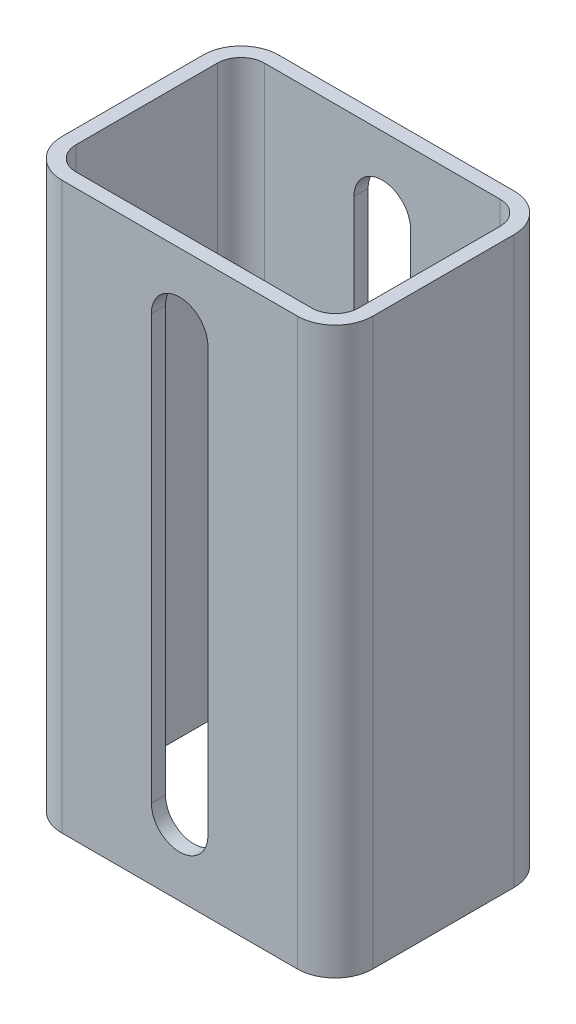
ISO-10303-21;
HEADER;
FILE_DESCRIPTION(('STEP AP214'),'2;1');
FILE_NAME('part.step','',(''),(''),'','','');
FILE_SCHEMA(('AUTOMOTIVE_DESIGN { 1 0 10303 214 1 1 1 1 }'));
ENDSEC;
DATA;
#1=APPLICATION_CONTEXT('core data for automotive mechanical design processes');
#2=APPLICATION_PROTOCOL_DEFINITION('international standard','automotive_design',2000,#1);
#3=PRODUCT_CONTEXT('',#1,'mechanical');
#4=PRODUCT('Part','Part','',(#3));
#5=PRODUCT_RELATED_PRODUCT_CATEGORY('part','',(#4));
#6=PRODUCT_DEFINITION_FORMATION('','',#4);
#7=PRODUCT_DEFINITION_CONTEXT('part definition',#1,'design');
#8=PRODUCT_DEFINITION('design','',#6,#7);
#9=PRODUCT_DEFINITION_SHAPE('','',#8);
#10=(LENGTH_UNIT() NAMED_UNIT(*) SI_UNIT(.MILLI.,.METRE.));
#11=(NAMED_UNIT(*) PLANE_ANGLE_UNIT() SI_UNIT($,.RADIAN.));
#12=(NAMED_UNIT(*) SI_UNIT($,.STERADIAN.) SOLID_ANGLE_UNIT());
#13=UNCERTAINTY_MEASURE_WITH_UNIT(LENGTH_MEASURE(1.E-05),#10,'distance_accuracy_value','');
#14=(GEOMETRIC_REPRESENTATION_CONTEXT(3) GLOBAL_UNCERTAINTY_ASSIGNED_CONTEXT((#13)) GLOBAL_UNIT_ASSIGNED_CONTEXT((#10,
#11,#12)) REPRESENTATION_CONTEXT('',''));
#15=CARTESIAN_POINT('',(0.,0.,0.));
#16=DIRECTION('',(0.,0.,1.));
#17=DIRECTION('',(1.,0.,0.));
#18=AXIS2_PLACEMENT_3D('',#15,#16,#17);
#19=CARTESIAN_POINT('',(25.,60.,15.));
#20=DIRECTION('',(0.,1.,0.));
#21=DIRECTION('',(0.,0.,1.));
#22=AXIS2_PLACEMENT_3D('',#19,#20,#21);
#23=PLANE('',#22);
#24=CARTESIAN_POINT('',(25.,60.,15.));
#25=DIRECTION('',(0.,1.,0.));
#26=DIRECTION('',(1.,0.,0.));
#27=AXIS2_PLACEMENT_3D('',#24,#25,#26);
#28=CIRCLE('',#27,8.);
#29=CARTESIAN_POINT('',(25.,60.,23.));
#30=VERTEX_POINT('',#29);
#31=CARTESIAN_POINT('',(33.,60.,15.));
#32=VERTEX_POINT('',#31);
#33=EDGE_CURVE('E376',#30,#32,#28,.T.);
#34=ORIENTED_EDGE('',*,*,#33,.T.);
#35=DIRECTION('',(0.,0.,-1.));
#36=VECTOR('',#35,1.);
#37=CARTESIAN_POINT('',(33.,60.,15.));
#38=LINE('',#37,#36);
#39=CARTESIAN_POINT('',(33.,60.,-15.));
#40=VERTEX_POINT('',#39);
#41=EDGE_CURVE('E380',#32,#40,#38,.T.);
#42=ORIENTED_EDGE('',*,*,#41,.T.);
#43=CARTESIAN_POINT('',(25.,60.,-15.));
#44=DIRECTION('',(0.,1.,0.));
#45=DIRECTION('',(1.,0.,0.));
#46=AXIS2_PLACEMENT_3D('',#43,#44,#45);
#47=CIRCLE('',#46,8.);
#48=CARTESIAN_POINT('',(25.,60.,-23.));
#49=VERTEX_POINT('',#48);
#50=EDGE_CURVE('E384',#40,#49,#47,.T.);
#51=ORIENTED_EDGE('',*,*,#50,.T.);
#52=DIRECTION('',(-1.,0.,0.));
#53=VECTOR('',#52,1.);
#54=CARTESIAN_POINT('',(-25.,60.,-23.));
#55=LINE('',#54,#53);
#56=CARTESIAN_POINT('',(-25.,60.,-23.));
#57=VERTEX_POINT('',#56);
#58=EDGE_CURVE('E387',#49,#57,#55,.T.);
#59=ORIENTED_EDGE('',*,*,#58,.T.);
#60=CARTESIAN_POINT('',(-25.,60.,-15.));
#61=DIRECTION('',(0.,1.,0.));
#62=DIRECTION('',(1.,0.,0.));
#63=AXIS2_PLACEMENT_3D('',#60,#61,#62);
#64=CIRCLE('',#63,8.);
#65=CARTESIAN_POINT('',(-33.,60.,-15.));
#66=VERTEX_POINT('',#65);
#67=EDGE_CURVE('E390',#57,#66,#64,.T.);
#68=ORIENTED_EDGE('',*,*,#67,.T.);
#69=DIRECTION('',(0.,0.,1.));
#70=VECTOR('',#69,1.);
#71=CARTESIAN_POINT('',(-33.,60.,15.));
#72=LINE('',#71,#70);
#73=CARTESIAN_POINT('',(-33.,60.,15.));
#74=VERTEX_POINT('',#73);
#75=EDGE_CURVE('E393',#66,#74,#72,.T.);
#76=ORIENTED_EDGE('',*,*,#75,.T.);
#77=CARTESIAN_POINT('',(-25.,60.,15.));
#78=DIRECTION('',(0.,1.,0.));
#79=DIRECTION('',(1.,0.,0.));
#80=AXIS2_PLACEMENT_3D('',#77,#78,#79);
#81=CIRCLE('',#80,8.);
#82=CARTESIAN_POINT('',(-25.,60.,23.));
#83=VERTEX_POINT('',#82);
#84=EDGE_CURVE('E396',#74,#83,#81,.T.);
#85=ORIENTED_EDGE('',*,*,#84,.T.);
#86=DIRECTION('',(1.,0.,0.));
#87=VECTOR('',#86,1.);
#88=CARTESIAN_POINT('',(-25.,60.,23.));
#89=LINE('',#88,#87);
#90=EDGE_CURVE('E399',#83,#30,#89,.T.);
#91=ORIENTED_EDGE('',*,*,#90,.T.);
#92=EDGE_LOOP('',(#34,#42,#51,#59,#68,#76,#85,#91));
#93=FACE_BOUND('',#92,.T.);
#94=DIRECTION('',(0.,0.,-1.));
#95=VECTOR('',#94,1.);
#96=CARTESIAN_POINT('',(30.,60.,15.));
#97=LINE('',#96,#95);
#98=CARTESIAN_POINT('',(30.,60.,15.));
#99=VERTEX_POINT('',#98);
#100=CARTESIAN_POINT('',(30.,60.,-15.));
#101=VERTEX_POINT('',#100);
#102=EDGE_CURVE('E295',#99,#101,#97,.T.);
#103=ORIENTED_EDGE('',*,*,#102,.F.);
#104=CARTESIAN_POINT('',(25.,60.,15.));
#105=DIRECTION('',(0.,1.,0.));
#106=DIRECTION('',(0.,0.,1.));
#107=AXIS2_PLACEMENT_3D('',#104,#105,#106);
#108=CIRCLE('',#107,5.);
#109=CARTESIAN_POINT('',(25.,60.,20.));
#110=VERTEX_POINT('',#109);
#111=EDGE_CURVE('E292',#110,#99,#108,.T.);
#112=ORIENTED_EDGE('',*,*,#111,.F.);
#113=DIRECTION('',(1.,0.,0.));
#114=VECTOR('',#113,1.);
#115=CARTESIAN_POINT('',(-25.,60.,20.));
#116=LINE('',#115,#114);
#117=CARTESIAN_POINT('',(-25.,60.,20.));
#118=VERTEX_POINT('',#117);
#119=EDGE_CURVE('E315',#118,#110,#116,.T.);
#120=ORIENTED_EDGE('',*,*,#119,.F.);
#121=CARTESIAN_POINT('',(-25.,60.,15.));
#122=DIRECTION('',(0.,1.,0.));
#123=DIRECTION('',(0.,0.,-1.));
#124=AXIS2_PLACEMENT_3D('',#121,#122,#123);
#125=CIRCLE('',#124,5.);
#126=CARTESIAN_POINT('',(-30.,60.,15.));
#127=VERTEX_POINT('',#126);
#128=EDGE_CURVE('E311',#127,#118,#125,.T.);
#129=ORIENTED_EDGE('',*,*,#128,.F.);
#130=DIRECTION('',(0.,0.,1.));
#131=VECTOR('',#130,1.);
#132=CARTESIAN_POINT('',(-30.,60.,15.));
#133=LINE('',#132,#131);
#134=CARTESIAN_POINT('',(-30.,60.,-15.));
#135=VERTEX_POINT('',#134);
#136=EDGE_CURVE('E308',#135,#127,#133,.T.);
#137=ORIENTED_EDGE('',*,*,#136,.F.);
#138=CARTESIAN_POINT('',(-25.,60.,-15.));
#139=DIRECTION('',(0.,1.,0.));
#140=DIRECTION('',(0.,0.,-1.));
#141=AXIS2_PLACEMENT_3D('',#138,#139,#140);
#142=CIRCLE('',#141,5.);
#143=CARTESIAN_POINT('',(-25.,60.,-20.));
#144=VERTEX_POINT('',#143);
#145=EDGE_CURVE('E305',#144,#135,#142,.T.);
#146=ORIENTED_EDGE('',*,*,#145,.F.);
#147=DIRECTION('',(-1.,0.,0.));
#148=VECTOR('',#147,1.);
#149=CARTESIAN_POINT('',(-25.,60.,-20.));
#150=LINE('',#149,#148);
#151=CARTESIAN_POINT('',(25.,60.,-20.));
#152=VERTEX_POINT('',#151);
#153=EDGE_CURVE('E302',#152,#144,#150,.T.);
#154=ORIENTED_EDGE('',*,*,#153,.F.);
#155=CARTESIAN_POINT('',(25.,60.,-15.));
#156=DIRECTION('',(0.,1.,0.));
#157=DIRECTION('',(0.,0.,-1.));
#158=AXIS2_PLACEMENT_3D('',#155,#156,#157);
#159=CIRCLE('',#158,5.);
#160=EDGE_CURVE('E299',#101,#152,#159,.T.);
#161=ORIENTED_EDGE('',*,*,#160,.F.);
#162=EDGE_LOOP('',(#103,#112,#120,#129,#137,#146,#154,#161));
#163=FACE_BOUND('',#162,.T.);
#164=ADVANCED_FACE('F87',(#93,#163),#23,.T.);
#165=CARTESIAN_POINT('',(25.,-60.,15.));
#166=DIRECTION('',(0.,1.,0.));
#167=DIRECTION('',(0.,0.,1.));
#168=AXIS2_PLACEMENT_3D('',#165,#166,#167);
#169=PLANE('',#168);
#170=CARTESIAN_POINT('',(25.,-60.,15.));
#171=DIRECTION('',(0.,1.,0.));
#172=DIRECTION('',(1.,0.,0.));
#173=AXIS2_PLACEMENT_3D('',#170,#171,#172);
#174=CIRCLE('',#173,8.);
#175=CARTESIAN_POINT('',(25.,-60.,23.));
#176=VERTEX_POINT('',#175);
#177=CARTESIAN_POINT('',(33.,-60.,15.));
#178=VERTEX_POINT('',#177);
#179=EDGE_CURVE('E375',#176,#178,#174,.T.);
#180=ORIENTED_EDGE('',*,*,#179,.F.);
#181=DIRECTION('',(1.,0.,0.));
#182=VECTOR('',#181,1.);
#183=CARTESIAN_POINT('',(-25.,-60.,23.));
#184=LINE('',#183,#182);
#185=CARTESIAN_POINT('',(-25.,-60.,23.));
#186=VERTEX_POINT('',#185);
#187=EDGE_CURVE('E381',#186,#176,#184,.T.);
#188=ORIENTED_EDGE('',*,*,#187,.F.);
#189=CARTESIAN_POINT('',(-25.,-60.,15.));
#190=DIRECTION('',(0.,1.,0.));
#191=DIRECTION('',(1.,0.,0.));
#192=AXIS2_PLACEMENT_3D('',#189,#190,#191);
#193=CIRCLE('',#192,8.);
#194=CARTESIAN_POINT('',(-33.,-60.,15.));
#195=VERTEX_POINT('',#194);
#196=EDGE_CURVE('E421',#195,#186,#193,.T.);
#197=ORIENTED_EDGE('',*,*,#196,.F.);
#198=DIRECTION('',(0.,0.,1.));
#199=VECTOR('',#198,1.);
#200=CARTESIAN_POINT('',(-33.,-60.,15.));
#201=LINE('',#200,#199);
#202=CARTESIAN_POINT('',(-33.,-60.,-15.));
#203=VERTEX_POINT('',#202);
#204=EDGE_CURVE('E418',#203,#195,#201,.T.);
#205=ORIENTED_EDGE('',*,*,#204,.F.);
#206=CARTESIAN_POINT('',(-25.,-60.,-15.));
#207=DIRECTION('',(0.,1.,0.));
#208=DIRECTION('',(1.,0.,0.));
#209=AXIS2_PLACEMENT_3D('',#206,#207,#208);
#210=CIRCLE('',#209,8.);
#211=CARTESIAN_POINT('',(-25.,-60.,-23.));
#212=VERTEX_POINT('',#211);
#213=EDGE_CURVE('E415',#212,#203,#210,.T.);
#214=ORIENTED_EDGE('',*,*,#213,.F.);
#215=DIRECTION('',(-1.,0.,0.));
#216=VECTOR('',#215,1.);
#217=CARTESIAN_POINT('',(-25.,-60.,-23.));
#218=LINE('',#217,#216);
#219=CARTESIAN_POINT('',(25.,-60.,-23.));
#220=VERTEX_POINT('',#219);
#221=EDGE_CURVE('E412',#220,#212,#218,.T.);
#222=ORIENTED_EDGE('',*,*,#221,.F.);
#223=CARTESIAN_POINT('',(25.,-60.,-15.));
#224=DIRECTION('',(0.,1.,0.));
#225=DIRECTION('',(1.,0.,0.));
#226=AXIS2_PLACEMENT_3D('',#223,#224,#225);
#227=CIRCLE('',#226,8.);
#228=CARTESIAN_POINT('',(33.,-60.,-15.));
#229=VERTEX_POINT('',#228);
#230=EDGE_CURVE('E409',#229,#220,#227,.T.);
#231=ORIENTED_EDGE('',*,*,#230,.F.);
#232=DIRECTION('',(0.,0.,-1.));
#233=VECTOR('',#232,1.);
#234=CARTESIAN_POINT('',(33.,-60.,15.));
#235=LINE('',#234,#233);
#236=EDGE_CURVE('E406',#178,#229,#235,.T.);
#237=ORIENTED_EDGE('',*,*,#236,.F.);
#238=EDGE_LOOP('',(#180,#188,#197,#205,#214,#222,#231,#237));
#239=FACE_BOUND('',#238,.T.);
#240=CARTESIAN_POINT('',(25.,-60.,15.));
#241=DIRECTION('',(0.,1.,0.));
#242=DIRECTION('',(0.,0.,1.));
#243=AXIS2_PLACEMENT_3D('',#240,#241,#242);
#244=CIRCLE('',#243,5.);
#245=CARTESIAN_POINT('',(25.,-60.,20.));
#246=VERTEX_POINT('',#245);
#247=CARTESIAN_POINT('',(30.,-60.,15.));
#248=VERTEX_POINT('',#247);
#249=EDGE_CURVE('E319',#246,#248,#244,.T.);
#250=ORIENTED_EDGE('',*,*,#249,.T.);
#251=DIRECTION('',(0.,0.,-1.));
#252=VECTOR('',#251,1.);
#253=CARTESIAN_POINT('',(30.,-60.,15.));
#254=LINE('',#253,#252);
#255=CARTESIAN_POINT('',(30.,-60.,-15.));
#256=VERTEX_POINT('',#255);
#257=EDGE_CURVE('E323',#248,#256,#254,.T.);
#258=ORIENTED_EDGE('',*,*,#257,.T.);
#259=CARTESIAN_POINT('',(25.,-60.,-15.));
#260=DIRECTION('',(0.,1.,0.));
#261=DIRECTION('',(0.,0.,-1.));
#262=AXIS2_PLACEMENT_3D('',#259,#260,#261);
#263=CIRCLE('',#262,5.);
#264=CARTESIAN_POINT('',(25.,-60.,-20.));
#265=VERTEX_POINT('',#264);
#266=EDGE_CURVE('E327',#256,#265,#263,.T.);
#267=ORIENTED_EDGE('',*,*,#266,.T.);
#268=DIRECTION('',(-1.,0.,0.));
#269=VECTOR('',#268,1.);
#270=CARTESIAN_POINT('',(-25.,-60.,-20.));
#271=LINE('',#270,#269);
#272=CARTESIAN_POINT('',(-25.,-60.,-20.));
#273=VERTEX_POINT('',#272);
#274=EDGE_CURVE('E331',#265,#273,#271,.T.);
#275=ORIENTED_EDGE('',*,*,#274,.T.);
#276=CARTESIAN_POINT('',(-25.,-60.,-15.));
#277=DIRECTION('',(0.,1.,0.));
#278=DIRECTION('',(0.,0.,-1.));
#279=AXIS2_PLACEMENT_3D('',#276,#277,#278);
#280=CIRCLE('',#279,5.);
#281=CARTESIAN_POINT('',(-30.,-60.,-15.));
#282=VERTEX_POINT('',#281);
#283=EDGE_CURVE('E335',#273,#282,#280,.T.);
#284=ORIENTED_EDGE('',*,*,#283,.T.);
#285=DIRECTION('',(0.,0.,1.));
#286=VECTOR('',#285,1.);
#287=CARTESIAN_POINT('',(-30.,-60.,15.));
#288=LINE('',#287,#286);
#289=CARTESIAN_POINT('',(-30.,-60.,15.));
#290=VERTEX_POINT('',#289);
#291=EDGE_CURVE('E339',#282,#290,#288,.T.);
#292=ORIENTED_EDGE('',*,*,#291,.T.);
#293=CARTESIAN_POINT('',(-25.,-60.,15.));
#294=DIRECTION('',(0.,1.,0.));
#295=DIRECTION('',(0.,0.,-1.));
#296=AXIS2_PLACEMENT_3D('',#293,#294,#295);
#297=CIRCLE('',#296,5.);
#298=CARTESIAN_POINT('',(-25.,-60.,20.));
#299=VERTEX_POINT('',#298);
#300=EDGE_CURVE('E343',#290,#299,#297,.T.);
#301=ORIENTED_EDGE('',*,*,#300,.T.);
#302=DIRECTION('',(1.,0.,0.));
#303=VECTOR('',#302,1.);
#304=CARTESIAN_POINT('',(-25.,-60.,20.));
#305=LINE('',#304,#303);
#306=EDGE_CURVE('E296',#299,#246,#305,.T.);
#307=ORIENTED_EDGE('',*,*,#306,.T.);
#308=EDGE_LOOP('',(#250,#258,#267,#275,#284,#292,#301,#307));
#309=FACE_BOUND('',#308,.T.);
#310=ADVANCED_FACE('F528',(#239,#309),#169,.F.);
#311=CARTESIAN_POINT('',(25.,60.,15.));
#312=DIRECTION('',(0.,-1.,0.));
#313=DIRECTION('',(0.,0.,-1.));
#314=AXIS2_PLACEMENT_3D('',#311,#312,#313);
#315=CYLINDRICAL_SURFACE('',#314,8.);
#316=ORIENTED_EDGE('',*,*,#179,.T.);
#317=DIRECTION('',(0.,-1.,0.));
#318=VECTOR('',#317,1.);
#319=CARTESIAN_POINT('',(33.,60.,15.));
#320=LINE('',#319,#318);
#321=EDGE_CURVE('E453',#32,#178,#320,.T.);
#322=ORIENTED_EDGE('',*,*,#321,.F.);
#323=ORIENTED_EDGE('',*,*,#33,.F.);
#324=DIRECTION('',(0.,-1.,0.));
#325=VECTOR('',#324,1.);
#326=CARTESIAN_POINT('',(25.,60.,23.));
#327=LINE('',#326,#325);
#328=EDGE_CURVE('E402',#30,#176,#327,.T.);
#329=ORIENTED_EDGE('',*,*,#328,.T.);
#330=EDGE_LOOP('',(#316,#322,#323,#329));
#331=FACE_BOUND('',#330,.T.);
#332=ADVANCED_FACE('F89',(#331),#315,.T.);
#333=CARTESIAN_POINT('',(33.,60.,15.));
#334=DIRECTION('',(-1.,0.,0.));
#335=DIRECTION('',(0.,0.,1.));
#336=AXIS2_PLACEMENT_3D('',#333,#334,#335);
#337=PLANE('',#336);
#338=ORIENTED_EDGE('',*,*,#236,.T.);
#339=DIRECTION('',(0.,-1.,0.));
#340=VECTOR('',#339,1.);
#341=CARTESIAN_POINT('',(33.,60.,-15.));
#342=LINE('',#341,#340);
#343=EDGE_CURVE('E449',#40,#229,#342,.T.);
#344=ORIENTED_EDGE('',*,*,#343,.F.);
#345=ORIENTED_EDGE('',*,*,#41,.F.);
#346=ORIENTED_EDGE('',*,*,#321,.T.);
#347=EDGE_LOOP('',(#338,#344,#345,#346));
#348=FACE_BOUND('',#347,.T.);
#349=ADVANCED_FACE('F596',(#348),#337,.F.);
#350=CARTESIAN_POINT('',(25.,60.,-15.));
#351=DIRECTION('',(0.,-1.,0.));
#352=DIRECTION('',(0.,0.,-1.));
#353=AXIS2_PLACEMENT_3D('',#350,#351,#352);
#354=CYLINDRICAL_SURFACE('',#353,8.);
#355=ORIENTED_EDGE('',*,*,#230,.T.);
#356=DIRECTION('',(0.,-1.,0.));
#357=VECTOR('',#356,1.);
#358=CARTESIAN_POINT('',(25.,60.,-23.));
#359=LINE('',#358,#357);
#360=EDGE_CURVE('E445',#49,#220,#359,.T.);
#361=ORIENTED_EDGE('',*,*,#360,.F.);
#362=ORIENTED_EDGE('',*,*,#50,.F.);
#363=ORIENTED_EDGE('',*,*,#343,.T.);
#364=EDGE_LOOP('',(#355,#361,#362,#363));
#365=FACE_BOUND('',#364,.T.);
#366=ADVANCED_FACE('F594',(#365),#354,.T.);
#367=CARTESIAN_POINT('',(-25.,60.,-23.));
#368=DIRECTION('',(0.,0.,1.));
#369=DIRECTION('',(1.,0.,0.));
#370=AXIS2_PLACEMENT_3D('',#367,#368,#369);
#371=PLANE('',#370);
#372=DIRECTION('',(0.,1.,0.));
#373=VECTOR('',#372,1.);
#374=CARTESIAN_POINT('',(6.,45.,-23.));
#375=LINE('',#374,#373);
#376=CARTESIAN_POINT('',(6.,-45.,-23.));
#377=VERTEX_POINT('',#376);
#378=CARTESIAN_POINT('',(6.,45.,-23.));
#379=VERTEX_POINT('',#378);
#380=EDGE_CURVE('E493',#377,#379,#375,.T.);
#381=ORIENTED_EDGE('',*,*,#380,.T.);
#382=CARTESIAN_POINT('',(0.,45.,-23.));
#383=DIRECTION('',(0.,0.,1.));
#384=DIRECTION('',(1.,0.,0.));
#385=AXIS2_PLACEMENT_3D('',#382,#383,#384);
#386=CIRCLE('',#385,6.);
#387=CARTESIAN_POINT('',(-6.,45.,-23.));
#388=VERTEX_POINT('',#387);
#389=EDGE_CURVE('E501',#379,#388,#386,.T.);
#390=ORIENTED_EDGE('',*,*,#389,.T.);
#391=DIRECTION('',(0.,-1.,0.));
#392=VECTOR('',#391,1.);
#393=CARTESIAN_POINT('',(-6.,45.,-23.));
#394=LINE('',#393,#392);
#395=CARTESIAN_POINT('',(-6.,-45.,-23.));
#396=VERTEX_POINT('',#395);
#397=EDGE_CURVE('E253',#388,#396,#394,.T.);
#398=ORIENTED_EDGE('',*,*,#397,.T.);
#399=CARTESIAN_POINT('',(0.,-45.,-23.));
#400=DIRECTION('',(0.,0.,1.));
#401=DIRECTION('',(1.,0.,0.));
#402=AXIS2_PLACEMENT_3D('',#399,#400,#401);
#403=CIRCLE('',#402,6.);
#404=EDGE_CURVE('E106',#396,#377,#403,.T.);
#405=ORIENTED_EDGE('',*,*,#404,.T.);
#406=EDGE_LOOP('',(#381,#390,#398,#405));
#407=FACE_BOUND('',#406,.T.);
#408=ORIENTED_EDGE('',*,*,#221,.T.);
#409=DIRECTION('',(0.,-1.,0.));
#410=VECTOR('',#409,1.);
#411=CARTESIAN_POINT('',(-25.,60.,-23.));
#412=LINE('',#411,#410);
#413=EDGE_CURVE('E441',#57,#212,#412,.T.);
#414=ORIENTED_EDGE('',*,*,#413,.F.);
#415=ORIENTED_EDGE('',*,*,#58,.F.);
#416=ORIENTED_EDGE('',*,*,#360,.T.);
#417=EDGE_LOOP('',(#408,#414,#415,#416));
#418=FACE_BOUND('',#417,.T.);
#419=ADVANCED_FACE('F504',(#407,#418),#371,.F.);
#420=CARTESIAN_POINT('',(-25.,60.,-15.));
#421=DIRECTION('',(0.,-1.,0.));
#422=DIRECTION('',(0.,0.,-1.));
#423=AXIS2_PLACEMENT_3D('',#420,#421,#422);
#424=CYLINDRICAL_SURFACE('',#423,8.);
#425=ORIENTED_EDGE('',*,*,#213,.T.);
#426=DIRECTION('',(0.,-1.,0.));
#427=VECTOR('',#426,1.);
#428=CARTESIAN_POINT('',(-33.,60.,-15.));
#429=LINE('',#428,#427);
#430=EDGE_CURVE('E437',#66,#203,#429,.T.);
#431=ORIENTED_EDGE('',*,*,#430,.F.);
#432=ORIENTED_EDGE('',*,*,#67,.F.);
#433=ORIENTED_EDGE('',*,*,#413,.T.);
#434=EDGE_LOOP('',(#425,#431,#432,#433));
#435=FACE_BOUND('',#434,.T.);
#436=ADVANCED_FACE('F587',(#435),#424,.T.);
#437=CARTESIAN_POINT('',(-33.,60.,15.));
#438=DIRECTION('',(1.,0.,0.));
#439=DIRECTION('',(0.,0.,-1.));
#440=AXIS2_PLACEMENT_3D('',#437,#438,#439);
#441=PLANE('',#440);
#442=ORIENTED_EDGE('',*,*,#204,.T.);
#443=DIRECTION('',(0.,-1.,0.));
#444=VECTOR('',#443,1.);
#445=CARTESIAN_POINT('',(-33.,60.,15.));
#446=LINE('',#445,#444);
#447=EDGE_CURVE('E433',#74,#195,#446,.T.);
#448=ORIENTED_EDGE('',*,*,#447,.F.);
#449=ORIENTED_EDGE('',*,*,#75,.F.);
#450=ORIENTED_EDGE('',*,*,#430,.T.);
#451=EDGE_LOOP('',(#442,#448,#449,#450));
#452=FACE_BOUND('',#451,.T.);
#453=ADVANCED_FACE('F583',(#452),#441,.F.);
#454=CARTESIAN_POINT('',(-25.,60.,15.));
#455=DIRECTION('',(0.,-1.,0.));
#456=DIRECTION('',(0.,0.,-1.));
#457=AXIS2_PLACEMENT_3D('',#454,#455,#456);
#458=CYLINDRICAL_SURFACE('',#457,8.);
#459=ORIENTED_EDGE('',*,*,#196,.T.);
#460=DIRECTION('',(0.,-1.,0.));
#461=VECTOR('',#460,1.);
#462=CARTESIAN_POINT('',(-25.,60.,23.));
#463=LINE('',#462,#461);
#464=EDGE_CURVE('E429',#83,#186,#463,.T.);
#465=ORIENTED_EDGE('',*,*,#464,.F.);
#466=ORIENTED_EDGE('',*,*,#84,.F.);
#467=ORIENTED_EDGE('',*,*,#447,.T.);
#468=EDGE_LOOP('',(#459,#465,#466,#467));
#469=FACE_BOUND('',#468,.T.);
#470=ADVANCED_FACE('F580',(#469),#458,.T.);
#471=CARTESIAN_POINT('',(-25.,60.,23.));
#472=DIRECTION('',(0.,0.,-1.));
#473=DIRECTION('',(-1.,0.,0.));
#474=AXIS2_PLACEMENT_3D('',#471,#472,#473);
#475=PLANE('',#474);
#476=DIRECTION('',(0.,-1.,0.));
#477=VECTOR('',#476,1.);
#478=CARTESIAN_POINT('',(-6.,45.,23.));
#479=LINE('',#478,#477);
#480=CARTESIAN_POINT('',(-6.,45.,23.));
#481=VERTEX_POINT('',#480);
#482=CARTESIAN_POINT('',(-6.,-45.,23.));
#483=VERTEX_POINT('',#482);
#484=EDGE_CURVE('E276',#481,#483,#479,.T.);
#485=ORIENTED_EDGE('',*,*,#484,.F.);
#486=CARTESIAN_POINT('',(0.,45.,23.));
#487=DIRECTION('',(0.,0.,1.));
#488=DIRECTION('',(1.,0.,0.));
#489=AXIS2_PLACEMENT_3D('',#486,#487,#488);
#490=CIRCLE('',#489,6.);
#491=CARTESIAN_POINT('',(6.,45.,23.));
#492=VERTEX_POINT('',#491);
#493=EDGE_CURVE('E91',#492,#481,#490,.T.);
#494=ORIENTED_EDGE('',*,*,#493,.F.);
#495=DIRECTION('',(0.,1.,0.));
#496=VECTOR('',#495,1.);
#497=CARTESIAN_POINT('',(6.,45.,23.));
#498=LINE('',#497,#496);
#499=CARTESIAN_POINT('',(6.,-45.,23.));
#500=VERTEX_POINT('',#499);
#501=EDGE_CURVE('E130',#500,#492,#498,.T.);
#502=ORIENTED_EDGE('',*,*,#501,.F.);
#503=CARTESIAN_POINT('',(0.,-45.,23.));
#504=DIRECTION('',(0.,0.,1.));
#505=DIRECTION('',(1.,0.,0.));
#506=AXIS2_PLACEMENT_3D('',#503,#504,#505);
#507=CIRCLE('',#506,6.);
#508=EDGE_CURVE('E288',#483,#500,#507,.T.);
#509=ORIENTED_EDGE('',*,*,#508,.F.);
#510=EDGE_LOOP('',(#485,#494,#502,#509));
#511=FACE_BOUND('',#510,.T.);
#512=ORIENTED_EDGE('',*,*,#187,.T.);
#513=ORIENTED_EDGE('',*,*,#328,.F.);
#514=ORIENTED_EDGE('',*,*,#90,.F.);
#515=ORIENTED_EDGE('',*,*,#464,.T.);
#516=EDGE_LOOP('',(#512,#513,#514,#515));
#517=FACE_BOUND('',#516,.T.);
#518=ADVANCED_FACE('F476',(#511,#517),#475,.F.);
#519=CARTESIAN_POINT('',(25.,60.,15.));
#520=DIRECTION('',(0.,-1.,0.));
#521=DIRECTION('',(0.,0.,-1.));
#522=AXIS2_PLACEMENT_3D('',#519,#520,#521);
#523=CYLINDRICAL_SURFACE('',#522,5.);
#524=ORIENTED_EDGE('',*,*,#249,.F.);
#525=DIRECTION('',(0.,-1.,0.));
#526=VECTOR('',#525,1.);
#527=CARTESIAN_POINT('',(25.,60.,20.));
#528=LINE('',#527,#526);
#529=EDGE_CURVE('E318',#110,#246,#528,.T.);
#530=ORIENTED_EDGE('',*,*,#529,.F.);
#531=ORIENTED_EDGE('',*,*,#111,.T.);
#532=DIRECTION('',(0.,-1.,0.));
#533=VECTOR('',#532,1.);
#534=CARTESIAN_POINT('',(30.,60.,15.));
#535=LINE('',#534,#533);
#536=EDGE_CURVE('E371',#99,#248,#535,.T.);
#537=ORIENTED_EDGE('',*,*,#536,.T.);
#538=EDGE_LOOP('',(#524,#530,#531,#537));
#539=FACE_BOUND('',#538,.T.);
#540=ADVANCED_FACE('F539',(#539),#523,.F.);
#541=CARTESIAN_POINT('',(30.,60.,15.));
#542=DIRECTION('',(-1.,0.,0.));
#543=DIRECTION('',(0.,0.,1.));
#544=AXIS2_PLACEMENT_3D('',#541,#542,#543);
#545=PLANE('',#544);
#546=ORIENTED_EDGE('',*,*,#257,.F.);
#547=ORIENTED_EDGE('',*,*,#536,.F.);
#548=ORIENTED_EDGE('',*,*,#102,.T.);
#549=DIRECTION('',(0.,-1.,0.));
#550=VECTOR('',#549,1.);
#551=CARTESIAN_POINT('',(30.,60.,-15.));
#552=LINE('',#551,#550);
#553=EDGE_CURVE('E368',#101,#256,#552,.T.);
#554=ORIENTED_EDGE('',*,*,#553,.T.);
#555=EDGE_LOOP('',(#546,#547,#548,#554));
#556=FACE_BOUND('',#555,.T.);
#557=ADVANCED_FACE('F543',(#556),#545,.T.);
#558=CARTESIAN_POINT('',(25.,60.,-15.));
#559=DIRECTION('',(0.,-1.,0.));
#560=DIRECTION('',(0.,0.,-1.));
#561=AXIS2_PLACEMENT_3D('',#558,#559,#560);
#562=CYLINDRICAL_SURFACE('',#561,5.);
#563=ORIENTED_EDGE('',*,*,#266,.F.);
#564=ORIENTED_EDGE('',*,*,#553,.F.);
#565=ORIENTED_EDGE('',*,*,#160,.T.);
#566=DIRECTION('',(0.,-1.,0.));
#567=VECTOR('',#566,1.);
#568=CARTESIAN_POINT('',(25.,60.,-20.));
#569=LINE('',#568,#567);
#570=EDGE_CURVE('E365',#152,#265,#569,.T.);
#571=ORIENTED_EDGE('',*,*,#570,.T.);
#572=EDGE_LOOP('',(#563,#564,#565,#571));
#573=FACE_BOUND('',#572,.T.);
#574=ADVANCED_FACE('F547',(#573),#562,.F.);
#575=CARTESIAN_POINT('',(-25.,60.,-20.));
#576=DIRECTION('',(0.,0.,1.));
#577=DIRECTION('',(1.,0.,0.));
#578=AXIS2_PLACEMENT_3D('',#575,#576,#577);
#579=PLANE('',#578);
#580=CARTESIAN_POINT('',(0.,45.,-20.));
#581=DIRECTION('',(0.,0.,1.));
#582=DIRECTION('',(1.,0.,0.));
#583=AXIS2_PLACEMENT_3D('',#580,#581,#582);
#584=CIRCLE('',#583,6.);
#585=CARTESIAN_POINT('',(6.,45.,-20.));
#586=VERTEX_POINT('',#585);
#587=CARTESIAN_POINT('',(-6.,45.,-20.));
#588=VERTEX_POINT('',#587);
#589=EDGE_CURVE('E262',#586,#588,#584,.T.);
#590=ORIENTED_EDGE('',*,*,#589,.F.);
#591=DIRECTION('',(0.,1.,0.));
#592=VECTOR('',#591,1.);
#593=CARTESIAN_POINT('',(6.,60.,-20.));
#594=LINE('',#593,#592);
#595=CARTESIAN_POINT('',(6.,-45.,-20.));
#596=VERTEX_POINT('',#595);
#597=EDGE_CURVE('E289',#596,#586,#594,.T.);
#598=ORIENTED_EDGE('',*,*,#597,.F.);
#599=CARTESIAN_POINT('',(0.,-45.,-20.));
#600=DIRECTION('',(0.,0.,1.));
#601=DIRECTION('',(1.,0.,0.));
#602=AXIS2_PLACEMENT_3D('',#599,#600,#601);
#603=CIRCLE('',#602,6.);
#604=CARTESIAN_POINT('',(-6.,-45.,-20.));
#605=VERTEX_POINT('',#604);
#606=EDGE_CURVE('E274',#605,#596,#603,.T.);
#607=ORIENTED_EDGE('',*,*,#606,.F.);
#608=DIRECTION('',(0.,-1.,0.));
#609=VECTOR('',#608,1.);
#610=CARTESIAN_POINT('',(-6.,60.,-20.));
#611=LINE('',#610,#609);
#612=EDGE_CURVE('E250',#588,#605,#611,.T.);
#613=ORIENTED_EDGE('',*,*,#612,.F.);
#614=EDGE_LOOP('',(#590,#598,#607,#613));
#615=FACE_BOUND('',#614,.T.);
#616=ORIENTED_EDGE('',*,*,#274,.F.);
#617=ORIENTED_EDGE('',*,*,#570,.F.);
#618=ORIENTED_EDGE('',*,*,#153,.T.);
#619=DIRECTION('',(0.,-1.,0.));
#620=VECTOR('',#619,1.);
#621=CARTESIAN_POINT('',(-25.,60.,-20.));
#622=LINE('',#621,#620);
#623=EDGE_CURVE('E362',#144,#273,#622,.T.);
#624=ORIENTED_EDGE('',*,*,#623,.T.);
#625=EDGE_LOOP('',(#616,#617,#618,#624));
#626=FACE_BOUND('',#625,.T.);
#627=ADVANCED_FACE('F271',(#615,#626),#579,.T.);
#628=CARTESIAN_POINT('',(-25.,60.,-15.));
#629=DIRECTION('',(0.,-1.,0.));
#630=DIRECTION('',(0.,0.,-1.));
#631=AXIS2_PLACEMENT_3D('',#628,#629,#630);
#632=CYLINDRICAL_SURFACE('',#631,5.);
#633=ORIENTED_EDGE('',*,*,#283,.F.);
#634=ORIENTED_EDGE('',*,*,#623,.F.);
#635=ORIENTED_EDGE('',*,*,#145,.T.);
#636=DIRECTION('',(0.,-1.,0.));
#637=VECTOR('',#636,1.);
#638=CARTESIAN_POINT('',(-30.,60.,-15.));
#639=LINE('',#638,#637);
#640=EDGE_CURVE('E359',#135,#282,#639,.T.);
#641=ORIENTED_EDGE('',*,*,#640,.T.);
#642=EDGE_LOOP('',(#633,#634,#635,#641));
#643=FACE_BOUND('',#642,.T.);
#644=ADVANCED_FACE('F554',(#643),#632,.F.);
#645=CARTESIAN_POINT('',(-30.,60.,15.));
#646=DIRECTION('',(1.,0.,0.));
#647=DIRECTION('',(0.,0.,-1.));
#648=AXIS2_PLACEMENT_3D('',#645,#646,#647);
#649=PLANE('',#648);
#650=ORIENTED_EDGE('',*,*,#291,.F.);
#651=ORIENTED_EDGE('',*,*,#640,.F.);
#652=ORIENTED_EDGE('',*,*,#136,.T.);
#653=DIRECTION('',(0.,-1.,0.));
#654=VECTOR('',#653,1.);
#655=CARTESIAN_POINT('',(-30.,60.,15.));
#656=LINE('',#655,#654);
#657=EDGE_CURVE('E356',#127,#290,#656,.T.);
#658=ORIENTED_EDGE('',*,*,#657,.T.);
#659=EDGE_LOOP('',(#650,#651,#652,#658));
#660=FACE_BOUND('',#659,.T.);
#661=ADVANCED_FACE('F558',(#660),#649,.T.);
#662=CARTESIAN_POINT('',(-25.,60.,15.));
#663=DIRECTION('',(0.,-1.,0.));
#664=DIRECTION('',(0.,0.,-1.));
#665=AXIS2_PLACEMENT_3D('',#662,#663,#664);
#666=CYLINDRICAL_SURFACE('',#665,5.);
#667=ORIENTED_EDGE('',*,*,#300,.F.);
#668=ORIENTED_EDGE('',*,*,#657,.F.);
#669=ORIENTED_EDGE('',*,*,#128,.T.);
#670=DIRECTION('',(0.,-1.,0.));
#671=VECTOR('',#670,1.);
#672=CARTESIAN_POINT('',(-25.,60.,20.));
#673=LINE('',#672,#671);
#674=EDGE_CURVE('E353',#118,#299,#673,.T.);
#675=ORIENTED_EDGE('',*,*,#674,.T.);
#676=EDGE_LOOP('',(#667,#668,#669,#675));
#677=FACE_BOUND('',#676,.T.);
#678=ADVANCED_FACE('F522',(#677),#666,.F.);
#679=CARTESIAN_POINT('',(-25.,60.,20.));
#680=DIRECTION('',(0.,0.,-1.));
#681=DIRECTION('',(-1.,0.,0.));
#682=AXIS2_PLACEMENT_3D('',#679,#680,#681);
#683=PLANE('',#682);
#684=CARTESIAN_POINT('',(0.,45.,20.));
#685=DIRECTION('',(0.,0.,-1.));
#686=DIRECTION('',(-1.,0.,0.));
#687=AXIS2_PLACEMENT_3D('',#684,#685,#686);
#688=CIRCLE('',#687,6.);
#689=CARTESIAN_POINT('',(-6.,45.,20.));
#690=VERTEX_POINT('',#689);
#691=CARTESIAN_POINT('',(6.,45.,20.));
#692=VERTEX_POINT('',#691);
#693=EDGE_CURVE('E12',#690,#692,#688,.T.);
#694=ORIENTED_EDGE('',*,*,#693,.F.);
#695=DIRECTION('',(0.,1.,0.));
#696=VECTOR('',#695,1.);
#697=CARTESIAN_POINT('',(-6.,60.,20.));
#698=LINE('',#697,#696);
#699=CARTESIAN_POINT('',(-6.,-45.,20.));
#700=VERTEX_POINT('',#699);
#701=EDGE_CURVE('E457',#700,#690,#698,.T.);
#702=ORIENTED_EDGE('',*,*,#701,.F.);
#703=CARTESIAN_POINT('',(0.,-45.,20.));
#704=DIRECTION('',(0.,0.,-1.));
#705=DIRECTION('',(-1.,0.,0.));
#706=AXIS2_PLACEMENT_3D('',#703,#704,#705);
#707=CIRCLE('',#706,6.);
#708=CARTESIAN_POINT('',(6.,-45.,20.));
#709=VERTEX_POINT('',#708);
#710=EDGE_CURVE('E460',#709,#700,#707,.T.);
#711=ORIENTED_EDGE('',*,*,#710,.F.);
#712=DIRECTION('',(0.,-1.,0.));
#713=VECTOR('',#712,1.);
#714=CARTESIAN_POINT('',(6.,60.,20.));
#715=LINE('',#714,#713);
#716=EDGE_CURVE('E98',#692,#709,#715,.T.);
#717=ORIENTED_EDGE('',*,*,#716,.F.);
#718=EDGE_LOOP('',(#694,#702,#711,#717));
#719=FACE_BOUND('',#718,.T.);
#720=ORIENTED_EDGE('',*,*,#306,.F.);
#721=ORIENTED_EDGE('',*,*,#674,.F.);
#722=ORIENTED_EDGE('',*,*,#119,.T.);
#723=ORIENTED_EDGE('',*,*,#529,.T.);
#724=EDGE_LOOP('',(#720,#721,#722,#723));
#725=FACE_BOUND('',#724,.T.);
#726=ADVANCED_FACE('F519',(#719,#725),#683,.T.);
#727=CARTESIAN_POINT('',(-6.,45.,-23.));
#728=DIRECTION('',(-1.,0.,0.));
#729=DIRECTION('',(0.,-1.,0.));
#730=AXIS2_PLACEMENT_3D('',#727,#728,#729);
#731=PLANE('',#730);
#732=DIRECTION('',(0.,0.,1.));
#733=VECTOR('',#732,1.);
#734=CARTESIAN_POINT('',(-6.,-45.,-23.));
#735=LINE('',#734,#733);
#736=EDGE_CURVE('E239',#700,#483,#735,.T.);
#737=ORIENTED_EDGE('',*,*,#736,.F.);
#738=ORIENTED_EDGE('',*,*,#701,.T.);
#739=DIRECTION('',(0.,0.,1.));
#740=VECTOR('',#739,1.);
#741=CARTESIAN_POINT('',(-6.,45.,-23.));
#742=LINE('',#741,#740);
#743=EDGE_CURVE('E258',#690,#481,#742,.T.);
#744=ORIENTED_EDGE('',*,*,#743,.T.);
#745=ORIENTED_EDGE('',*,*,#484,.T.);
#746=EDGE_LOOP('',(#737,#738,#744,#745));
#747=FACE_BOUND('',#746,.T.);
#748=ADVANCED_FACE('F478',(#747),#731,.F.);
#749=CARTESIAN_POINT('',(0.,-45.,-23.));
#750=DIRECTION('',(0.,0.,1.));
#751=DIRECTION('',(1.,0.,0.));
#752=AXIS2_PLACEMENT_3D('',#749,#750,#751);
#753=CYLINDRICAL_SURFACE('',#752,6.);
#754=DIRECTION('',(0.,0.,1.));
#755=VECTOR('',#754,1.);
#756=CARTESIAN_POINT('',(6.,-45.,-23.));
#757=LINE('',#756,#755);
#758=EDGE_CURVE('E486',#709,#500,#757,.T.);
#759=ORIENTED_EDGE('',*,*,#758,.F.);
#760=ORIENTED_EDGE('',*,*,#710,.T.);
#761=ORIENTED_EDGE('',*,*,#736,.T.);
#762=ORIENTED_EDGE('',*,*,#508,.T.);
#763=EDGE_LOOP('',(#759,#760,#761,#762));
#764=FACE_BOUND('',#763,.T.);
#765=ADVANCED_FACE('F481',(#764),#753,.F.);
#766=CARTESIAN_POINT('',(6.,45.,-23.));
#767=DIRECTION('',(1.,0.,0.));
#768=DIRECTION('',(0.,1.,0.));
#769=AXIS2_PLACEMENT_3D('',#766,#767,#768);
#770=PLANE('',#769);
#771=DIRECTION('',(0.,0.,1.));
#772=VECTOR('',#771,1.);
#773=CARTESIAN_POINT('',(6.,45.,-23.));
#774=LINE('',#773,#772);
#775=EDGE_CURVE('E281',#692,#492,#774,.T.);
#776=ORIENTED_EDGE('',*,*,#775,.F.);
#777=ORIENTED_EDGE('',*,*,#716,.T.);
#778=ORIENTED_EDGE('',*,*,#758,.T.);
#779=ORIENTED_EDGE('',*,*,#501,.T.);
#780=EDGE_LOOP('',(#776,#777,#778,#779));
#781=FACE_BOUND('',#780,.T.);
#782=ADVANCED_FACE('F517',(#781),#770,.F.);
#783=CARTESIAN_POINT('',(0.,45.,-23.));
#784=DIRECTION('',(0.,0.,1.));
#785=DIRECTION('',(1.,0.,0.));
#786=AXIS2_PLACEMENT_3D('',#783,#784,#785);
#787=CYLINDRICAL_SURFACE('',#786,6.);
#788=ORIENTED_EDGE('',*,*,#743,.F.);
#789=ORIENTED_EDGE('',*,*,#693,.T.);
#790=ORIENTED_EDGE('',*,*,#775,.T.);
#791=ORIENTED_EDGE('',*,*,#493,.T.);
#792=EDGE_LOOP('',(#788,#789,#790,#791));
#793=FACE_BOUND('',#792,.T.);
#794=ADVANCED_FACE('F472',(#793),#787,.F.);
#795=ORIENTED_EDGE('',*,*,#589,.T.);
#796=EDGE_CURVE('E246',#388,#588,#742,.T.);
#797=ORIENTED_EDGE('',*,*,#796,.F.);
#798=ORIENTED_EDGE('',*,*,#389,.F.);
#799=EDGE_CURVE('E265',#379,#586,#774,.T.);
#800=ORIENTED_EDGE('',*,*,#799,.T.);
#801=EDGE_LOOP('',(#795,#797,#798,#800));
#802=FACE_BOUND('',#801,.T.);
#803=ADVANCED_FACE('F263',(#802),#787,.F.);
#804=ORIENTED_EDGE('',*,*,#597,.T.);
#805=ORIENTED_EDGE('',*,*,#799,.F.);
#806=ORIENTED_EDGE('',*,*,#380,.F.);
#807=EDGE_CURVE('E488',#377,#596,#757,.T.);
#808=ORIENTED_EDGE('',*,*,#807,.T.);
#809=EDGE_LOOP('',(#804,#805,#806,#808));
#810=FACE_BOUND('',#809,.T.);
#811=ADVANCED_FACE('F743',(#810),#770,.F.);
#812=ORIENTED_EDGE('',*,*,#606,.T.);
#813=ORIENTED_EDGE('',*,*,#807,.F.);
#814=ORIENTED_EDGE('',*,*,#404,.F.);
#815=EDGE_CURVE('E285',#396,#605,#735,.T.);
#816=ORIENTED_EDGE('',*,*,#815,.T.);
#817=EDGE_LOOP('',(#812,#813,#814,#816));
#818=FACE_BOUND('',#817,.T.);
#819=ADVANCED_FACE('F735',(#818),#753,.F.);
#820=ORIENTED_EDGE('',*,*,#612,.T.);
#821=ORIENTED_EDGE('',*,*,#815,.F.);
#822=ORIENTED_EDGE('',*,*,#397,.F.);
#823=ORIENTED_EDGE('',*,*,#796,.T.);
#824=EDGE_LOOP('',(#820,#821,#822,#823));
#825=FACE_BOUND('',#824,.T.);
#826=ADVANCED_FACE('F248',(#825),#731,.F.);
#827=CLOSED_SHELL('',(#164,#310,#332,#349,#366,#419,#436,#453,#470,#518,#540,#557,#574,#627,
#644,#661,#678,#726,#748,#765,#782,#794,#803,#811,#819,#826));
#828=MANIFOLD_SOLID_BREP('B2',#827);
#829=ADVANCED_BREP_SHAPE_REPRESENTATION('',(#18,#828),#14);
#830=SHAPE_DEFINITION_REPRESENTATION(#9,#829);
ENDSEC;
END-ISO-10303-21;
